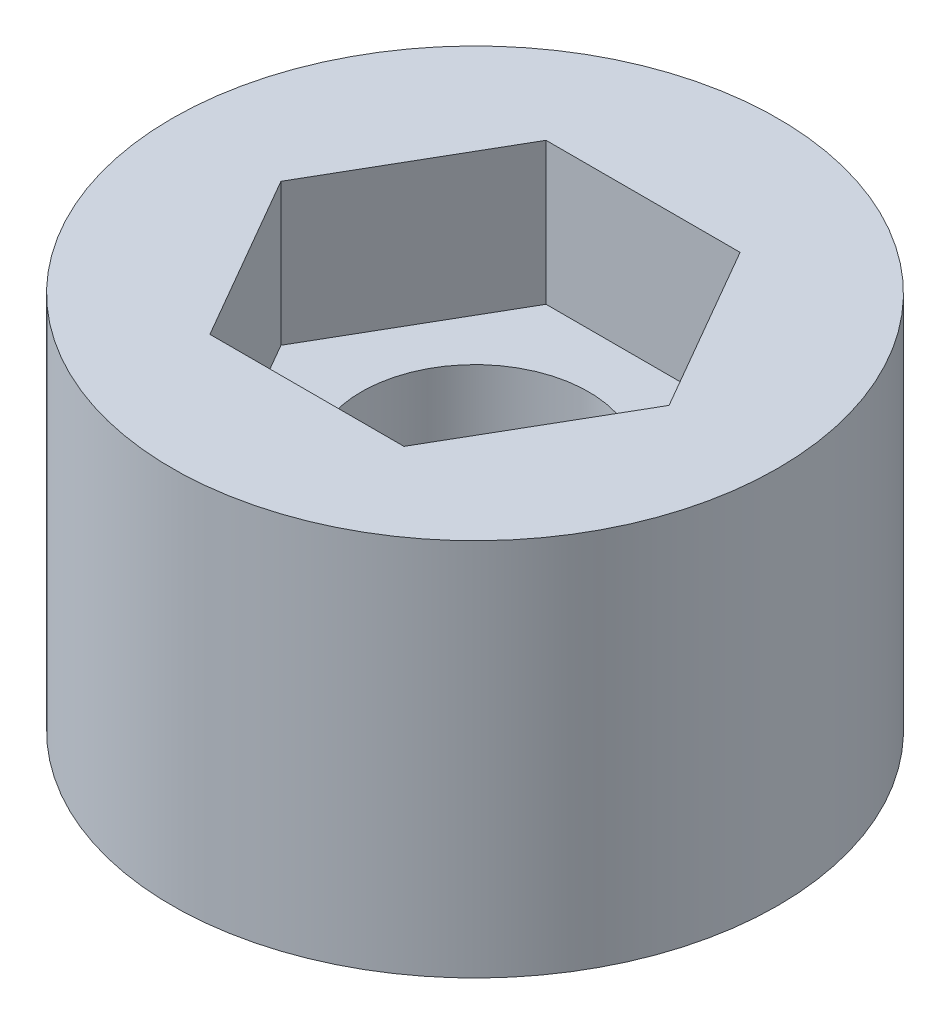
ISO-10303-21;
HEADER;
FILE_DESCRIPTION(('STEP AP214'),'2;1');
FILE_NAME('part.step','',(''),(''),'','','');
FILE_SCHEMA(('AUTOMOTIVE_DESIGN { 1 0 10303 214 1 1 1 1 }'));
ENDSEC;
DATA;
#1=APPLICATION_CONTEXT('core data for automotive mechanical design processes');
#2=APPLICATION_PROTOCOL_DEFINITION('international standard','automotive_design',2000,#1);
#3=PRODUCT_CONTEXT('',#1,'mechanical');
#4=PRODUCT('Part','Part','',(#3));
#5=PRODUCT_RELATED_PRODUCT_CATEGORY('part','',(#4));
#6=PRODUCT_DEFINITION_FORMATION('','',#4);
#7=PRODUCT_DEFINITION_CONTEXT('part definition',#1,'design');
#8=PRODUCT_DEFINITION('design','',#6,#7);
#9=PRODUCT_DEFINITION_SHAPE('','',#8);
#10=(LENGTH_UNIT() NAMED_UNIT(*) SI_UNIT(.MILLI.,.METRE.));
#11=(NAMED_UNIT(*) PLANE_ANGLE_UNIT() SI_UNIT($,.RADIAN.));
#12=(NAMED_UNIT(*) SI_UNIT($,.STERADIAN.) SOLID_ANGLE_UNIT());
#13=UNCERTAINTY_MEASURE_WITH_UNIT(LENGTH_MEASURE(1.E-05),#10,'distance_accuracy_value','');
#14=(GEOMETRIC_REPRESENTATION_CONTEXT(3) GLOBAL_UNCERTAINTY_ASSIGNED_CONTEXT((#13)) GLOBAL_UNIT_ASSIGNED_CONTEXT((#10,
#11,#12)) REPRESENTATION_CONTEXT('',''));
#15=CARTESIAN_POINT('',(0.,0.,0.));
#16=DIRECTION('',(0.,0.,1.));
#17=DIRECTION('',(1.,0.,0.));
#18=AXIS2_PLACEMENT_3D('',#15,#16,#17);
#19=CARTESIAN_POINT('',(0.,8.,0.));
#20=DIRECTION('',(0.,-1.,0.));
#21=DIRECTION('',(0.,0.,-1.));
#22=AXIS2_PLACEMENT_3D('',#19,#20,#21);
#23=CYLINDRICAL_SURFACE('',#22,2.4);
#24=CARTESIAN_POINT('',(0.,0.,0.));
#25=DIRECTION('',(0.,1.,0.));
#26=DIRECTION('',(0.,0.,1.));
#27=AXIS2_PLACEMENT_3D('',#24,#25,#26);
#28=CIRCLE('',#27,2.4);
#29=CARTESIAN_POINT('',(0.,0.,2.4));
#30=VERTEX_POINT('',#29);
#31=EDGE_CURVE('E147',#30,#30,#28,.T.);
#32=ORIENTED_EDGE('',*,*,#31,.F.);
#33=EDGE_LOOP('',(#32));
#34=FACE_BOUND('',#33,.T.);
#35=CARTESIAN_POINT('',(0.,5.,0.));
#36=DIRECTION('',(0.,1.,0.));
#37=DIRECTION('',(0.,0.,1.));
#38=AXIS2_PLACEMENT_3D('',#35,#36,#37);
#39=CIRCLE('',#38,2.4);
#40=CARTESIAN_POINT('',(0.,5.,2.4));
#41=VERTEX_POINT('',#40);
#42=EDGE_CURVE('E42',#41,#41,#39,.T.);
#43=ORIENTED_EDGE('',*,*,#42,.T.);
#44=EDGE_LOOP('',(#43));
#45=FACE_BOUND('',#44,.T.);
#46=ADVANCED_FACE('F38',(#34,#45),#23,.F.);
#47=CARTESIAN_POINT('',(0.,8.,0.));
#48=DIRECTION('',(0.,1.,0.));
#49=DIRECTION('',(0.,0.,1.));
#50=AXIS2_PLACEMENT_3D('',#47,#48,#49);
#51=PLANE('',#50);
#52=DIRECTION('',(0.5,0.,-0.866025403784439));
#53=VECTOR('',#52,1.);
#54=CARTESIAN_POINT('',(2.04959345562317,8.,3.55));
#55=LINE('',#54,#53);
#56=CARTESIAN_POINT('',(2.04959345562317,8.,3.55));
#57=VERTEX_POINT('',#56);
#58=CARTESIAN_POINT('',(4.09918691124634,8.,0.));
#59=VERTEX_POINT('',#58);
#60=EDGE_CURVE('E55',#57,#59,#55,.T.);
#61=ORIENTED_EDGE('',*,*,#60,.F.);
#62=DIRECTION('',(1.,0.,0.));
#63=VECTOR('',#62,1.);
#64=CARTESIAN_POINT('',(-2.04959345562317,8.,3.55));
#65=LINE('',#64,#63);
#66=CARTESIAN_POINT('',(-2.04959345562317,8.,3.55));
#67=VERTEX_POINT('',#66);
#68=EDGE_CURVE('E138',#67,#57,#65,.T.);
#69=ORIENTED_EDGE('',*,*,#68,.F.);
#70=DIRECTION('',(0.5,0.,0.866025403784439));
#71=VECTOR('',#70,1.);
#72=CARTESIAN_POINT('',(-4.09918691124634,8.,0.));
#73=LINE('',#72,#71);
#74=CARTESIAN_POINT('',(-4.09918691124634,8.,0.));
#75=VERTEX_POINT('',#74);
#76=EDGE_CURVE('E136',#75,#67,#73,.T.);
#77=ORIENTED_EDGE('',*,*,#76,.F.);
#78=DIRECTION('',(-0.5,0.,0.866025403784438));
#79=VECTOR('',#78,1.);
#80=CARTESIAN_POINT('',(-2.04959345562317,8.,-3.55));
#81=LINE('',#80,#79);
#82=CARTESIAN_POINT('',(-2.04959345562317,8.,-3.55));
#83=VERTEX_POINT('',#82);
#84=EDGE_CURVE('E103',#83,#75,#81,.T.);
#85=ORIENTED_EDGE('',*,*,#84,.F.);
#86=DIRECTION('',(-1.,0.,0.));
#87=VECTOR('',#86,1.);
#88=CARTESIAN_POINT('',(2.04959345562317,8.,-3.55));
#89=LINE('',#88,#87);
#90=CARTESIAN_POINT('',(2.04959345562317,8.,-3.55));
#91=VERTEX_POINT('',#90);
#92=EDGE_CURVE('E132',#91,#83,#89,.T.);
#93=ORIENTED_EDGE('',*,*,#92,.F.);
#94=DIRECTION('',(-0.5,0.,-0.866025403784439));
#95=VECTOR('',#94,1.);
#96=CARTESIAN_POINT('',(4.09918691124634,8.,0.));
#97=LINE('',#96,#95);
#98=EDGE_CURVE('E129',#59,#91,#97,.T.);
#99=ORIENTED_EDGE('',*,*,#98,.F.);
#100=EDGE_LOOP('',(#61,#69,#77,#85,#93,#99));
#101=FACE_BOUND('',#100,.T.);
#102=CARTESIAN_POINT('',(0.,8.,0.));
#103=DIRECTION('',(0.,1.,0.));
#104=DIRECTION('',(1.,0.,0.));
#105=AXIS2_PLACEMENT_3D('',#102,#103,#104);
#106=CIRCLE('',#105,6.4);
#107=CARTESIAN_POINT('',(6.4,8.,0.));
#108=VERTEX_POINT('',#107);
#109=EDGE_CURVE('E12',#108,#108,#106,.T.);
#110=ORIENTED_EDGE('',*,*,#109,.T.);
#111=EDGE_LOOP('',(#110));
#112=FACE_BOUND('',#111,.T.);
#113=ADVANCED_FACE('F156',(#101,#112),#51,.T.);
#114=CARTESIAN_POINT('',(0.,0.,0.));
#115=DIRECTION('',(0.,1.,0.));
#116=DIRECTION('',(0.,0.,1.));
#117=AXIS2_PLACEMENT_3D('',#114,#115,#116);
#118=PLANE('',#117);
#119=CARTESIAN_POINT('',(0.,0.,0.));
#120=DIRECTION('',(0.,1.,0.));
#121=DIRECTION('',(1.,0.,0.));
#122=AXIS2_PLACEMENT_3D('',#119,#120,#121);
#123=CIRCLE('',#122,6.4);
#124=CARTESIAN_POINT('',(6.4,0.,0.));
#125=VERTEX_POINT('',#124);
#126=EDGE_CURVE('E47',#125,#125,#123,.T.);
#127=ORIENTED_EDGE('',*,*,#126,.F.);
#128=EDGE_LOOP('',(#127));
#129=FACE_BOUND('',#128,.T.);
#130=ORIENTED_EDGE('',*,*,#31,.T.);
#131=EDGE_LOOP('',(#130));
#132=FACE_BOUND('',#131,.T.);
#133=ADVANCED_FACE('F153',(#129,#132),#118,.F.);
#134=CARTESIAN_POINT('',(0.,8.,0.));
#135=DIRECTION('',(0.,-1.,0.));
#136=DIRECTION('',(0.,0.,-1.));
#137=AXIS2_PLACEMENT_3D('',#134,#135,#136);
#138=CYLINDRICAL_SURFACE('',#137,6.4);
#139=ORIENTED_EDGE('',*,*,#109,.F.);
#140=EDGE_LOOP('',(#139));
#141=FACE_BOUND('',#140,.T.);
#142=ORIENTED_EDGE('',*,*,#126,.T.);
#143=EDGE_LOOP('',(#142));
#144=FACE_BOUND('',#143,.T.);
#145=ADVANCED_FACE('F40',(#141,#144),#138,.T.);
#146=CARTESIAN_POINT('',(2.04959345562317,5.,3.55));
#147=DIRECTION('',(0.866025403784439,0.,0.5));
#148=DIRECTION('',(0.5,0.,-0.866025403784439));
#149=AXIS2_PLACEMENT_3D('',#146,#147,#148);
#150=PLANE('',#149);
#151=ORIENTED_EDGE('',*,*,#60,.T.);
#152=DIRECTION('',(0.,1.,0.));
#153=VECTOR('',#152,1.);
#154=CARTESIAN_POINT('',(4.09918691124634,5.,0.));
#155=LINE('',#154,#153);
#156=CARTESIAN_POINT('',(4.09918691124634,5.,0.));
#157=VERTEX_POINT('',#156);
#158=EDGE_CURVE('E85',#157,#59,#155,.T.);
#159=ORIENTED_EDGE('',*,*,#158,.F.);
#160=DIRECTION('',(0.5,0.,-0.866025403784439));
#161=VECTOR('',#160,1.);
#162=CARTESIAN_POINT('',(2.04959345562317,5.,3.55));
#163=LINE('',#162,#161);
#164=CARTESIAN_POINT('',(2.04959345562317,5.,3.55));
#165=VERTEX_POINT('',#164);
#166=EDGE_CURVE('E140',#165,#157,#163,.T.);
#167=ORIENTED_EDGE('',*,*,#166,.F.);
#168=DIRECTION('',(0.,1.,0.));
#169=VECTOR('',#168,1.);
#170=CARTESIAN_POINT('',(2.04959345562317,5.,3.55));
#171=LINE('',#170,#169);
#172=EDGE_CURVE('E63',#165,#57,#171,.T.);
#173=ORIENTED_EDGE('',*,*,#172,.T.);
#174=EDGE_LOOP('',(#151,#159,#167,#173));
#175=FACE_BOUND('',#174,.T.);
#176=ADVANCED_FACE('F178',(#175),#150,.F.);
#177=CARTESIAN_POINT('',(-2.04959345562317,5.,3.55));
#178=DIRECTION('',(0.,0.,1.));
#179=DIRECTION('',(1.,0.,0.));
#180=AXIS2_PLACEMENT_3D('',#177,#178,#179);
#181=PLANE('',#180);
#182=ORIENTED_EDGE('',*,*,#68,.T.);
#183=ORIENTED_EDGE('',*,*,#172,.F.);
#184=DIRECTION('',(1.,0.,0.));
#185=VECTOR('',#184,1.);
#186=CARTESIAN_POINT('',(-2.04959345562317,5.,3.55));
#187=LINE('',#186,#185);
#188=CARTESIAN_POINT('',(-2.04959345562317,5.,3.55));
#189=VERTEX_POINT('',#188);
#190=EDGE_CURVE('E115',#189,#165,#187,.T.);
#191=ORIENTED_EDGE('',*,*,#190,.F.);
#192=DIRECTION('',(0.,1.,0.));
#193=VECTOR('',#192,1.);
#194=CARTESIAN_POINT('',(-2.04959345562317,5.,3.55));
#195=LINE('',#194,#193);
#196=EDGE_CURVE('E107',#189,#67,#195,.T.);
#197=ORIENTED_EDGE('',*,*,#196,.T.);
#198=EDGE_LOOP('',(#182,#183,#191,#197));
#199=FACE_BOUND('',#198,.T.);
#200=ADVANCED_FACE('F175',(#199),#181,.F.);
#201=CARTESIAN_POINT('',(-4.09918691124634,5.,0.));
#202=DIRECTION('',(-0.866025403784439,0.,0.5));
#203=DIRECTION('',(0.5,0.,0.866025403784439));
#204=AXIS2_PLACEMENT_3D('',#201,#202,#203);
#205=PLANE('',#204);
#206=ORIENTED_EDGE('',*,*,#76,.T.);
#207=ORIENTED_EDGE('',*,*,#196,.F.);
#208=DIRECTION('',(0.5,0.,0.866025403784439));
#209=VECTOR('',#208,1.);
#210=CARTESIAN_POINT('',(-4.09918691124634,5.,0.));
#211=LINE('',#210,#209);
#212=CARTESIAN_POINT('',(-4.09918691124634,5.,0.));
#213=VERTEX_POINT('',#212);
#214=EDGE_CURVE('E111',#213,#189,#211,.T.);
#215=ORIENTED_EDGE('',*,*,#214,.F.);
#216=DIRECTION('',(0.,1.,0.));
#217=VECTOR('',#216,1.);
#218=CARTESIAN_POINT('',(-4.09918691124634,5.,0.));
#219=LINE('',#218,#217);
#220=EDGE_CURVE('E96',#213,#75,#219,.T.);
#221=ORIENTED_EDGE('',*,*,#220,.T.);
#222=EDGE_LOOP('',(#206,#207,#215,#221));
#223=FACE_BOUND('',#222,.T.);
#224=ADVANCED_FACE('F112',(#223),#205,.F.);
#225=CARTESIAN_POINT('',(-2.04959345562317,5.,-3.55));
#226=DIRECTION('',(-0.866025403784439,0.,-0.5));
#227=DIRECTION('',(-0.5,0.,0.866025403784439));
#228=AXIS2_PLACEMENT_3D('',#225,#226,#227);
#229=PLANE('',#228);
#230=ORIENTED_EDGE('',*,*,#84,.T.);
#231=ORIENTED_EDGE('',*,*,#220,.F.);
#232=DIRECTION('',(-0.5,0.,0.866025403784438));
#233=VECTOR('',#232,1.);
#234=CARTESIAN_POINT('',(-2.04959345562317,5.,-3.55));
#235=LINE('',#234,#233);
#236=CARTESIAN_POINT('',(-2.04959345562317,5.,-3.55));
#237=VERTEX_POINT('',#236);
#238=EDGE_CURVE('E100',#237,#213,#235,.T.);
#239=ORIENTED_EDGE('',*,*,#238,.F.);
#240=DIRECTION('',(0.,1.,0.));
#241=VECTOR('',#240,1.);
#242=CARTESIAN_POINT('',(-2.04959345562317,5.,-3.55));
#243=LINE('',#242,#241);
#244=EDGE_CURVE('E108',#237,#83,#243,.T.);
#245=ORIENTED_EDGE('',*,*,#244,.T.);
#246=EDGE_LOOP('',(#230,#231,#239,#245));
#247=FACE_BOUND('',#246,.T.);
#248=ADVANCED_FACE('F98',(#247),#229,.F.);
#249=CARTESIAN_POINT('',(2.04959345562317,5.,-3.55));
#250=DIRECTION('',(0.,0.,-1.));
#251=DIRECTION('',(-1.,0.,0.));
#252=AXIS2_PLACEMENT_3D('',#249,#250,#251);
#253=PLANE('',#252);
#254=ORIENTED_EDGE('',*,*,#92,.T.);
#255=ORIENTED_EDGE('',*,*,#244,.F.);
#256=DIRECTION('',(-1.,0.,0.));
#257=VECTOR('',#256,1.);
#258=CARTESIAN_POINT('',(2.04959345562317,5.,-3.55));
#259=LINE('',#258,#257);
#260=CARTESIAN_POINT('',(2.04959345562317,5.,-3.55));
#261=VERTEX_POINT('',#260);
#262=EDGE_CURVE('E121',#261,#237,#259,.T.);
#263=ORIENTED_EDGE('',*,*,#262,.F.);
#264=DIRECTION('',(0.,1.,0.));
#265=VECTOR('',#264,1.);
#266=CARTESIAN_POINT('',(2.04959345562317,5.,-3.55));
#267=LINE('',#266,#265);
#268=EDGE_CURVE('E144',#261,#91,#267,.T.);
#269=ORIENTED_EDGE('',*,*,#268,.T.);
#270=EDGE_LOOP('',(#254,#255,#263,#269));
#271=FACE_BOUND('',#270,.T.);
#272=ADVANCED_FACE('F171',(#271),#253,.F.);
#273=CARTESIAN_POINT('',(4.09918691124634,5.,0.));
#274=DIRECTION('',(0.866025403784439,0.,-0.5));
#275=DIRECTION('',(-0.5,0.,-0.866025403784439));
#276=AXIS2_PLACEMENT_3D('',#273,#274,#275);
#277=PLANE('',#276);
#278=ORIENTED_EDGE('',*,*,#98,.T.);
#279=ORIENTED_EDGE('',*,*,#268,.F.);
#280=DIRECTION('',(-0.5,0.,-0.866025403784439));
#281=VECTOR('',#280,1.);
#282=CARTESIAN_POINT('',(4.09918691124634,5.,0.));
#283=LINE('',#282,#281);
#284=EDGE_CURVE('E123',#157,#261,#283,.T.);
#285=ORIENTED_EDGE('',*,*,#284,.F.);
#286=ORIENTED_EDGE('',*,*,#158,.T.);
#287=EDGE_LOOP('',(#278,#279,#285,#286));
#288=FACE_BOUND('',#287,.T.);
#289=ADVANCED_FACE('F166',(#288),#277,.F.);
#290=CARTESIAN_POINT('',(0.,5.,0.));
#291=DIRECTION('',(0.,1.,0.));
#292=DIRECTION('',(0.,0.,1.));
#293=AXIS2_PLACEMENT_3D('',#290,#291,#292);
#294=PLANE('',#293);
#295=ORIENTED_EDGE('',*,*,#42,.F.);
#296=EDGE_LOOP('',(#295));
#297=FACE_BOUND('',#296,.T.);
#298=ORIENTED_EDGE('',*,*,#166,.T.);
#299=ORIENTED_EDGE('',*,*,#284,.T.);
#300=ORIENTED_EDGE('',*,*,#262,.T.);
#301=ORIENTED_EDGE('',*,*,#238,.T.);
#302=ORIENTED_EDGE('',*,*,#214,.T.);
#303=ORIENTED_EDGE('',*,*,#190,.T.);
#304=EDGE_LOOP('',(#298,#299,#300,#301,#302,#303));
#305=FACE_BOUND('',#304,.T.);
#306=ADVANCED_FACE('F118',(#297,#305),#294,.T.);
#307=CLOSED_SHELL('',(#46,#113,#133,#145,#176,#200,#224,#248,#272,#289,#306));
#308=MANIFOLD_SOLID_BREP('B2',#307);
#309=ADVANCED_BREP_SHAPE_REPRESENTATION('',(#18,#308),#14);
#310=SHAPE_DEFINITION_REPRESENTATION(#9,#309);
ENDSEC;
END-ISO-10303-21;
